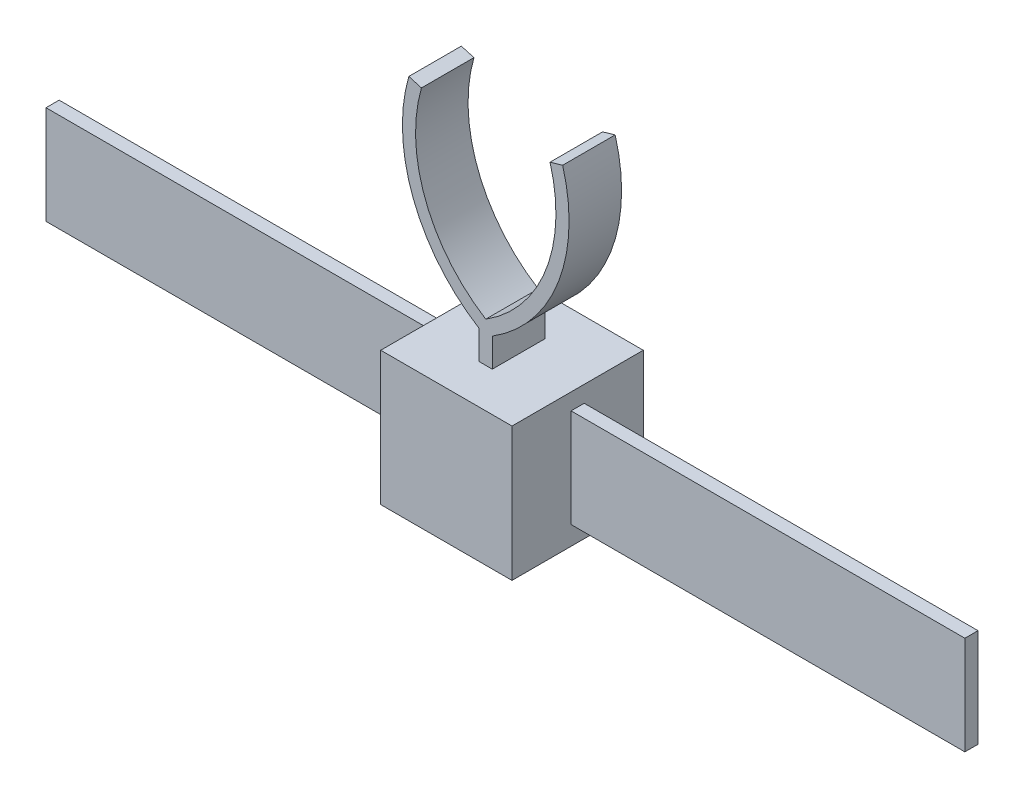
ISO-10303-21;
HEADER;
FILE_DESCRIPTION(('STEP AP214'),'2;1');
FILE_NAME('part.step','',(''),(''),'','','');
FILE_SCHEMA(('AUTOMOTIVE_DESIGN { 1 0 10303 214 1 1 1 1 }'));
ENDSEC;
DATA;
#1=APPLICATION_CONTEXT('core data for automotive mechanical design processes');
#2=APPLICATION_PROTOCOL_DEFINITION('international standard','automotive_design',2000,#1);
#3=PRODUCT_CONTEXT('',#1,'mechanical');
#4=PRODUCT('Part','Part','',(#3));
#5=PRODUCT_RELATED_PRODUCT_CATEGORY('part','',(#4));
#6=PRODUCT_DEFINITION_FORMATION('','',#4);
#7=PRODUCT_DEFINITION_CONTEXT('part definition',#1,'design');
#8=PRODUCT_DEFINITION('design','',#6,#7);
#9=PRODUCT_DEFINITION_SHAPE('','',#8);
#10=(LENGTH_UNIT() NAMED_UNIT(*) SI_UNIT(.MILLI.,.METRE.));
#11=(NAMED_UNIT(*) PLANE_ANGLE_UNIT() SI_UNIT($,.RADIAN.));
#12=(NAMED_UNIT(*) SI_UNIT($,.STERADIAN.) SOLID_ANGLE_UNIT());
#13=UNCERTAINTY_MEASURE_WITH_UNIT(LENGTH_MEASURE(1.E-05),#10,'distance_accuracy_value','');
#14=(GEOMETRIC_REPRESENTATION_CONTEXT(3) GLOBAL_UNCERTAINTY_ASSIGNED_CONTEXT((#13)) GLOBAL_UNIT_ASSIGNED_CONTEXT((#10,
#11,#12)) REPRESENTATION_CONTEXT('',''));
#15=CARTESIAN_POINT('',(0.,0.,0.));
#16=DIRECTION('',(0.,0.,1.));
#17=DIRECTION('',(1.,0.,0.));
#18=AXIS2_PLACEMENT_3D('',#15,#16,#17);
#19=CARTESIAN_POINT('',(50.,-50.9333333333334,100.));
#20=DIRECTION('',(-1.,0.,0.));
#21=DIRECTION('',(0.,0.,1.));
#22=AXIS2_PLACEMENT_3D('',#19,#20,#21);
#23=PLANE('',#22);
#24=DIRECTION('',(0.,0.,1.));
#25=VECTOR('',#24,1.);
#26=CARTESIAN_POINT('',(50.,-36.5666666666666,100.));
#27=LINE('',#26,#25);
#28=CARTESIAN_POINT('',(50.,-36.5666666666666,45.));
#29=VERTEX_POINT('',#28);
#30=CARTESIAN_POINT('',(50.,-36.5666666666666,55.));
#31=VERTEX_POINT('',#30);
#32=EDGE_CURVE('E408',#29,#31,#27,.T.);
#33=ORIENTED_EDGE('',*,*,#32,.T.);
#34=DIRECTION('',(0.,1.,0.));
#35=VECTOR('',#34,1.);
#36=CARTESIAN_POINT('',(50.,-50.9333333333334,55.));
#37=LINE('',#36,#35);
#38=CARTESIAN_POINT('',(50.,38.4333333333334,55.));
#39=VERTEX_POINT('',#38);
#40=EDGE_CURVE('E428',#31,#39,#37,.T.);
#41=ORIENTED_EDGE('',*,*,#40,.T.);
#42=DIRECTION('',(0.,0.,-1.));
#43=VECTOR('',#42,1.);
#44=CARTESIAN_POINT('',(50.,38.4333333333334,100.));
#45=LINE('',#44,#43);
#46=CARTESIAN_POINT('',(50.,38.4333333333334,45.));
#47=VERTEX_POINT('',#46);
#48=EDGE_CURVE('E425',#39,#47,#45,.T.);
#49=ORIENTED_EDGE('',*,*,#48,.T.);
#50=DIRECTION('',(0.,-1.,0.));
#51=VECTOR('',#50,1.);
#52=CARTESIAN_POINT('',(50.,-50.9333333333334,45.));
#53=LINE('',#52,#51);
#54=EDGE_CURVE('E422',#47,#29,#53,.T.);
#55=ORIENTED_EDGE('',*,*,#54,.T.);
#56=EDGE_LOOP('',(#33,#41,#49,#55));
#57=FACE_BOUND('',#56,.T.);
#58=DIRECTION('',(0.,1.,0.));
#59=VECTOR('',#58,1.);
#60=CARTESIAN_POINT('',(50.,-50.9333333333334,0.));
#61=LINE('',#60,#59);
#62=CARTESIAN_POINT('',(50.,-50.9333333333334,0.));
#63=VERTEX_POINT('',#62);
#64=CARTESIAN_POINT('',(50.,50.9333333333334,0.));
#65=VERTEX_POINT('',#64);
#66=EDGE_CURVE('E431',#63,#65,#61,.T.);
#67=ORIENTED_EDGE('',*,*,#66,.T.);
#68=DIRECTION('',(0.,0.,-1.));
#69=VECTOR('',#68,1.);
#70=CARTESIAN_POINT('',(50.,50.9333333333334,100.));
#71=LINE('',#70,#69);
#72=CARTESIAN_POINT('',(50.,50.9333333333334,100.));
#73=VERTEX_POINT('',#72);
#74=EDGE_CURVE('E458',#73,#65,#71,.T.);
#75=ORIENTED_EDGE('',*,*,#74,.F.);
#76=DIRECTION('',(0.,1.,0.));
#77=VECTOR('',#76,1.);
#78=CARTESIAN_POINT('',(50.,-50.9333333333334,100.));
#79=LINE('',#78,#77);
#80=CARTESIAN_POINT('',(50.,-50.9333333333334,100.));
#81=VERTEX_POINT('',#80);
#82=EDGE_CURVE('E432',#81,#73,#79,.T.);
#83=ORIENTED_EDGE('',*,*,#82,.F.);
#84=DIRECTION('',(0.,0.,-1.));
#85=VECTOR('',#84,1.);
#86=CARTESIAN_POINT('',(50.,-50.9333333333334,100.));
#87=LINE('',#86,#85);
#88=EDGE_CURVE('E442',#81,#63,#87,.T.);
#89=ORIENTED_EDGE('',*,*,#88,.T.);
#90=EDGE_LOOP('',(#67,#75,#83,#89));
#91=FACE_BOUND('',#90,.T.);
#92=ADVANCED_FACE('F176',(#57,#91),#23,.F.);
#93=CARTESIAN_POINT('',(-50.,50.9333333333334,100.));
#94=DIRECTION('',(0.,-1.,0.));
#95=DIRECTION('',(0.,0.,-1.));
#96=AXIS2_PLACEMENT_3D('',#93,#94,#95);
#97=PLANE('',#96);
#98=DIRECTION('',(0.,0.,-1.));
#99=VECTOR('',#98,1.);
#100=CARTESIAN_POINT('',(5.,50.9333333333334,100.));
#101=LINE('',#100,#99);
#102=CARTESIAN_POINT('',(5.,50.9333333333334,70.));
#103=VERTEX_POINT('',#102);
#104=CARTESIAN_POINT('',(5.,50.9333333333334,30.));
#105=VERTEX_POINT('',#104);
#106=EDGE_CURVE('E183',#103,#105,#101,.T.);
#107=ORIENTED_EDGE('',*,*,#106,.F.);
#108=DIRECTION('',(-1.,0.,0.));
#109=VECTOR('',#108,1.);
#110=CARTESIAN_POINT('',(-50.,50.9333333333334,70.));
#111=LINE('',#110,#109);
#112=CARTESIAN_POINT('',(-5.,50.9333333333334,70.));
#113=VERTEX_POINT('',#112);
#114=EDGE_CURVE('E12',#103,#113,#111,.T.);
#115=ORIENTED_EDGE('',*,*,#114,.T.);
#116=DIRECTION('',(0.,0.,-1.));
#117=VECTOR('',#116,1.);
#118=CARTESIAN_POINT('',(-5.,50.9333333333334,100.));
#119=LINE('',#118,#117);
#120=CARTESIAN_POINT('',(-5.,50.9333333333334,30.));
#121=VERTEX_POINT('',#120);
#122=EDGE_CURVE('E476',#113,#121,#119,.T.);
#123=ORIENTED_EDGE('',*,*,#122,.T.);
#124=DIRECTION('',(-1.,0.,0.));
#125=VECTOR('',#124,1.);
#126=CARTESIAN_POINT('',(-50.,50.9333333333334,30.));
#127=LINE('',#126,#125);
#128=EDGE_CURVE('E473',#105,#121,#127,.T.);
#129=ORIENTED_EDGE('',*,*,#128,.F.);
#130=EDGE_LOOP('',(#107,#115,#123,#129));
#131=FACE_BOUND('',#130,.T.);
#132=DIRECTION('',(-1.,0.,0.));
#133=VECTOR('',#132,1.);
#134=CARTESIAN_POINT('',(-50.,50.9333333333334,0.));
#135=LINE('',#134,#133);
#136=CARTESIAN_POINT('',(-50.,50.9333333333334,0.));
#137=VERTEX_POINT('',#136);
#138=EDGE_CURVE('E445',#65,#137,#135,.T.);
#139=ORIENTED_EDGE('',*,*,#138,.T.);
#140=DIRECTION('',(0.,0.,-1.));
#141=VECTOR('',#140,1.);
#142=CARTESIAN_POINT('',(-50.,50.9333333333334,100.));
#143=LINE('',#142,#141);
#144=CARTESIAN_POINT('',(-50.,50.9333333333334,100.));
#145=VERTEX_POINT('',#144);
#146=EDGE_CURVE('E455',#145,#137,#143,.T.);
#147=ORIENTED_EDGE('',*,*,#146,.F.);
#148=DIRECTION('',(-1.,0.,0.));
#149=VECTOR('',#148,1.);
#150=CARTESIAN_POINT('',(-50.,50.9333333333334,100.));
#151=LINE('',#150,#149);
#152=EDGE_CURVE('E435',#73,#145,#151,.T.);
#153=ORIENTED_EDGE('',*,*,#152,.F.);
#154=ORIENTED_EDGE('',*,*,#74,.T.);
#155=EDGE_LOOP('',(#139,#147,#153,#154));
#156=FACE_BOUND('',#155,.T.);
#157=ADVANCED_FACE('F517',(#131,#156),#97,.F.);
#158=CARTESIAN_POINT('',(-50.,-50.9333333333334,100.));
#159=DIRECTION('',(1.,0.,0.));
#160=DIRECTION('',(0.,0.,-1.));
#161=AXIS2_PLACEMENT_3D('',#158,#159,#160);
#162=PLANE('',#161);
#163=DIRECTION('',(0.,0.,1.));
#164=VECTOR('',#163,1.);
#165=CARTESIAN_POINT('',(-50.,38.4333333333334,100.));
#166=LINE('',#165,#164);
#167=CARTESIAN_POINT('',(-50.,38.4333333333334,45.));
#168=VERTEX_POINT('',#167);
#169=CARTESIAN_POINT('',(-50.,38.4333333333334,55.));
#170=VERTEX_POINT('',#169);
#171=EDGE_CURVE('E467',#168,#170,#166,.T.);
#172=ORIENTED_EDGE('',*,*,#171,.T.);
#173=DIRECTION('',(0.,-1.,0.));
#174=VECTOR('',#173,1.);
#175=CARTESIAN_POINT('',(-50.,-50.9333333333334,55.));
#176=LINE('',#175,#174);
#177=CARTESIAN_POINT('',(-50.,-36.5666666666666,55.));
#178=VERTEX_POINT('',#177);
#179=EDGE_CURVE('E470',#170,#178,#176,.T.);
#180=ORIENTED_EDGE('',*,*,#179,.T.);
#181=DIRECTION('',(0.,0.,-1.));
#182=VECTOR('',#181,1.);
#183=CARTESIAN_POINT('',(-50.,-36.5666666666666,100.));
#184=LINE('',#183,#182);
#185=CARTESIAN_POINT('',(-50.,-36.5666666666666,45.));
#186=VERTEX_POINT('',#185);
#187=EDGE_CURVE('E461',#178,#186,#184,.T.);
#188=ORIENTED_EDGE('',*,*,#187,.T.);
#189=DIRECTION('',(0.,1.,0.));
#190=VECTOR('',#189,1.);
#191=CARTESIAN_POINT('',(-50.,-50.9333333333334,45.));
#192=LINE('',#191,#190);
#193=EDGE_CURVE('E464',#186,#168,#192,.T.);
#194=ORIENTED_EDGE('',*,*,#193,.T.);
#195=EDGE_LOOP('',(#172,#180,#188,#194));
#196=FACE_BOUND('',#195,.T.);
#197=DIRECTION('',(0.,-1.,0.));
#198=VECTOR('',#197,1.);
#199=CARTESIAN_POINT('',(-50.,-50.9333333333334,0.));
#200=LINE('',#199,#198);
#201=CARTESIAN_POINT('',(-50.,-50.9333333333334,0.));
#202=VERTEX_POINT('',#201);
#203=EDGE_CURVE('E447',#137,#202,#200,.T.);
#204=ORIENTED_EDGE('',*,*,#203,.T.);
#205=DIRECTION('',(0.,0.,-1.));
#206=VECTOR('',#205,1.);
#207=CARTESIAN_POINT('',(-50.,-50.9333333333334,100.));
#208=LINE('',#207,#206);
#209=CARTESIAN_POINT('',(-50.,-50.9333333333334,100.));
#210=VERTEX_POINT('',#209);
#211=EDGE_CURVE('E452',#210,#202,#208,.T.);
#212=ORIENTED_EDGE('',*,*,#211,.F.);
#213=DIRECTION('',(0.,-1.,0.));
#214=VECTOR('',#213,1.);
#215=CARTESIAN_POINT('',(-50.,-50.9333333333334,100.));
#216=LINE('',#215,#214);
#217=EDGE_CURVE('E438',#145,#210,#216,.T.);
#218=ORIENTED_EDGE('',*,*,#217,.F.);
#219=ORIENTED_EDGE('',*,*,#146,.T.);
#220=EDGE_LOOP('',(#204,#212,#218,#219));
#221=FACE_BOUND('',#220,.T.);
#222=ADVANCED_FACE('F523',(#196,#221),#162,.F.);
#223=CARTESIAN_POINT('',(-50.,-50.9333333333334,100.));
#224=DIRECTION('',(0.,1.,0.));
#225=DIRECTION('',(0.,0.,1.));
#226=AXIS2_PLACEMENT_3D('',#223,#224,#225);
#227=PLANE('',#226);
#228=DIRECTION('',(1.,0.,0.));
#229=VECTOR('',#228,1.);
#230=CARTESIAN_POINT('',(-50.,-50.9333333333334,0.));
#231=LINE('',#230,#229);
#232=EDGE_CURVE('E436',#202,#63,#231,.T.);
#233=ORIENTED_EDGE('',*,*,#232,.T.);
#234=ORIENTED_EDGE('',*,*,#88,.F.);
#235=DIRECTION('',(1.,0.,0.));
#236=VECTOR('',#235,1.);
#237=CARTESIAN_POINT('',(-50.,-50.9333333333334,100.));
#238=LINE('',#237,#236);
#239=EDGE_CURVE('E440',#210,#81,#238,.T.);
#240=ORIENTED_EDGE('',*,*,#239,.F.);
#241=ORIENTED_EDGE('',*,*,#211,.T.);
#242=EDGE_LOOP('',(#233,#234,#240,#241));
#243=FACE_BOUND('',#242,.T.);
#244=ADVANCED_FACE('F541',(#243),#227,.F.);
#245=CARTESIAN_POINT('',(0.,0.,100.));
#246=DIRECTION('',(0.,0.,-1.));
#247=DIRECTION('',(-1.,0.,0.));
#248=AXIS2_PLACEMENT_3D('',#245,#246,#247);
#249=PLANE('',#248);
#250=ORIENTED_EDGE('',*,*,#82,.T.);
#251=ORIENTED_EDGE('',*,*,#152,.T.);
#252=ORIENTED_EDGE('',*,*,#217,.T.);
#253=ORIENTED_EDGE('',*,*,#239,.T.);
#254=EDGE_LOOP('',(#250,#251,#252,#253));
#255=FACE_BOUND('',#254,.T.);
#256=ADVANCED_FACE('F537',(#255),#249,.F.);
#257=CARTESIAN_POINT('',(0.,0.,0.));
#258=DIRECTION('',(0.,0.,-1.));
#259=DIRECTION('',(-1.,0.,0.));
#260=AXIS2_PLACEMENT_3D('',#257,#258,#259);
#261=PLANE('',#260);
#262=ORIENTED_EDGE('',*,*,#66,.F.);
#263=ORIENTED_EDGE('',*,*,#232,.F.);
#264=ORIENTED_EDGE('',*,*,#203,.F.);
#265=ORIENTED_EDGE('',*,*,#138,.F.);
#266=EDGE_LOOP('',(#262,#263,#264,#265));
#267=FACE_BOUND('',#266,.T.);
#268=ADVANCED_FACE('F531',(#267),#261,.T.);
#269=CARTESIAN_POINT('',(-350.,0.,0.));
#270=DIRECTION('',(-1.,0.,0.));
#271=DIRECTION('',(0.,0.,1.));
#272=AXIS2_PLACEMENT_3D('',#269,#270,#271);
#273=PLANE('',#272);
#274=DIRECTION('',(0.,-1.,0.));
#275=VECTOR('',#274,1.);
#276=CARTESIAN_POINT('',(-350.,-36.5666666666666,55.));
#277=LINE('',#276,#275);
#278=CARTESIAN_POINT('',(-350.,38.4333333333334,55.));
#279=VERTEX_POINT('',#278);
#280=CARTESIAN_POINT('',(-350.,-36.5666666666666,55.));
#281=VERTEX_POINT('',#280);
#282=EDGE_CURVE('E392',#279,#281,#277,.T.);
#283=ORIENTED_EDGE('',*,*,#282,.F.);
#284=DIRECTION('',(0.,0.,1.));
#285=VECTOR('',#284,1.);
#286=CARTESIAN_POINT('',(-350.,38.4333333333334,55.));
#287=LINE('',#286,#285);
#288=CARTESIAN_POINT('',(-350.,38.4333333333334,45.));
#289=VERTEX_POINT('',#288);
#290=EDGE_CURVE('E401',#289,#279,#287,.T.);
#291=ORIENTED_EDGE('',*,*,#290,.F.);
#292=DIRECTION('',(0.,1.,0.));
#293=VECTOR('',#292,1.);
#294=CARTESIAN_POINT('',(-350.,-36.5666666666666,45.));
#295=LINE('',#294,#293);
#296=CARTESIAN_POINT('',(-350.,-36.5666666666666,45.));
#297=VERTEX_POINT('',#296);
#298=EDGE_CURVE('E398',#297,#289,#295,.T.);
#299=ORIENTED_EDGE('',*,*,#298,.F.);
#300=DIRECTION('',(0.,0.,-1.));
#301=VECTOR('',#300,1.);
#302=CARTESIAN_POINT('',(-350.,-36.5666666666666,55.));
#303=LINE('',#302,#301);
#304=EDGE_CURVE('E395',#281,#297,#303,.T.);
#305=ORIENTED_EDGE('',*,*,#304,.F.);
#306=EDGE_LOOP('',(#283,#291,#299,#305));
#307=FACE_BOUND('',#306,.T.);
#308=ADVANCED_FACE('F553',(#307),#273,.T.);
#309=CARTESIAN_POINT('',(-350.,-36.5666666666666,55.));
#310=DIRECTION('',(0.,-1.,0.));
#311=DIRECTION('',(0.,0.,-1.));
#312=AXIS2_PLACEMENT_3D('',#309,#310,#311);
#313=PLANE('',#312);
#314=ORIENTED_EDGE('',*,*,#187,.F.);
#315=DIRECTION('',(1.,0.,0.));
#316=VECTOR('',#315,1.);
#317=CARTESIAN_POINT('',(-350.,-36.5666666666666,55.));
#318=LINE('',#317,#316);
#319=EDGE_CURVE('E417',#281,#178,#318,.T.);
#320=ORIENTED_EDGE('',*,*,#319,.F.);
#321=ORIENTED_EDGE('',*,*,#304,.T.);
#322=DIRECTION('',(1.,0.,0.));
#323=VECTOR('',#322,1.);
#324=CARTESIAN_POINT('',(-350.,-36.5666666666666,45.));
#325=LINE('',#324,#323);
#326=EDGE_CURVE('E414',#297,#186,#325,.T.);
#327=ORIENTED_EDGE('',*,*,#326,.T.);
#328=EDGE_LOOP('',(#314,#320,#321,#327));
#329=FACE_BOUND('',#328,.T.);
#330=ADVANCED_FACE('F568',(#329),#313,.T.);
#331=CARTESIAN_POINT('',(-350.,-36.5666666666666,45.));
#332=DIRECTION('',(0.,0.,-1.));
#333=DIRECTION('',(-1.,0.,0.));
#334=AXIS2_PLACEMENT_3D('',#331,#332,#333);
#335=PLANE('',#334);
#336=ORIENTED_EDGE('',*,*,#193,.F.);
#337=ORIENTED_EDGE('',*,*,#326,.F.);
#338=ORIENTED_EDGE('',*,*,#298,.T.);
#339=DIRECTION('',(1.,0.,0.));
#340=VECTOR('',#339,1.);
#341=CARTESIAN_POINT('',(-350.,38.4333333333334,45.));
#342=LINE('',#341,#340);
#343=EDGE_CURVE('E410',#289,#168,#342,.T.);
#344=ORIENTED_EDGE('',*,*,#343,.T.);
#345=EDGE_LOOP('',(#336,#337,#338,#344));
#346=FACE_BOUND('',#345,.T.);
#347=ADVANCED_FACE('F572',(#346),#335,.T.);
#348=CARTESIAN_POINT('',(-350.,38.4333333333334,55.));
#349=DIRECTION('',(0.,1.,0.));
#350=DIRECTION('',(0.,0.,1.));
#351=AXIS2_PLACEMENT_3D('',#348,#349,#350);
#352=PLANE('',#351);
#353=ORIENTED_EDGE('',*,*,#171,.F.);
#354=ORIENTED_EDGE('',*,*,#343,.F.);
#355=ORIENTED_EDGE('',*,*,#290,.T.);
#356=DIRECTION('',(1.,0.,0.));
#357=VECTOR('',#356,1.);
#358=CARTESIAN_POINT('',(-350.,38.4333333333334,55.));
#359=LINE('',#358,#357);
#360=EDGE_CURVE('E405',#279,#170,#359,.T.);
#361=ORIENTED_EDGE('',*,*,#360,.T.);
#362=EDGE_LOOP('',(#353,#354,#355,#361));
#363=FACE_BOUND('',#362,.T.);
#364=ADVANCED_FACE('F576',(#363),#352,.T.);
#365=CARTESIAN_POINT('',(-350.,-36.5666666666666,55.));
#366=DIRECTION('',(0.,0.,1.));
#367=DIRECTION('',(1.,0.,0.));
#368=AXIS2_PLACEMENT_3D('',#365,#366,#367);
#369=PLANE('',#368);
#370=ORIENTED_EDGE('',*,*,#179,.F.);
#371=ORIENTED_EDGE('',*,*,#360,.F.);
#372=ORIENTED_EDGE('',*,*,#282,.T.);
#373=ORIENTED_EDGE('',*,*,#319,.T.);
#374=EDGE_LOOP('',(#370,#371,#372,#373));
#375=FACE_BOUND('',#374,.T.);
#376=ADVANCED_FACE('F560',(#375),#369,.T.);
#377=ORIENTED_EDGE('',*,*,#40,.F.);
#378=CARTESIAN_POINT('',(350.,-36.5666666666666,55.));
#379=VERTEX_POINT('',#378);
#380=EDGE_CURVE('E404',#31,#379,#318,.T.);
#381=ORIENTED_EDGE('',*,*,#380,.T.);
#382=DIRECTION('',(0.,-1.,0.));
#383=VECTOR('',#382,1.);
#384=CARTESIAN_POINT('',(350.,-36.5666666666666,55.));
#385=LINE('',#384,#383);
#386=CARTESIAN_POINT('',(350.,38.4333333333334,55.));
#387=VERTEX_POINT('',#386);
#388=EDGE_CURVE('E379',#387,#379,#385,.T.);
#389=ORIENTED_EDGE('',*,*,#388,.F.);
#390=EDGE_CURVE('E409',#39,#387,#359,.T.);
#391=ORIENTED_EDGE('',*,*,#390,.F.);
#392=EDGE_LOOP('',(#377,#381,#389,#391));
#393=FACE_BOUND('',#392,.T.);
#394=ADVANCED_FACE('F556',(#393),#369,.T.);
#395=ORIENTED_EDGE('',*,*,#48,.F.);
#396=ORIENTED_EDGE('',*,*,#390,.T.);
#397=DIRECTION('',(0.,0.,1.));
#398=VECTOR('',#397,1.);
#399=CARTESIAN_POINT('',(350.,38.4333333333334,55.));
#400=LINE('',#399,#398);
#401=CARTESIAN_POINT('',(350.,38.4333333333334,45.));
#402=VERTEX_POINT('',#401);
#403=EDGE_CURVE('E389',#402,#387,#400,.T.);
#404=ORIENTED_EDGE('',*,*,#403,.F.);
#405=EDGE_CURVE('E413',#47,#402,#342,.T.);
#406=ORIENTED_EDGE('',*,*,#405,.F.);
#407=EDGE_LOOP('',(#395,#396,#404,#406));
#408=FACE_BOUND('',#407,.T.);
#409=ADVANCED_FACE('F559',(#408),#352,.T.);
#410=ORIENTED_EDGE('',*,*,#54,.F.);
#411=ORIENTED_EDGE('',*,*,#405,.T.);
#412=DIRECTION('',(0.,1.,0.));
#413=VECTOR('',#412,1.);
#414=CARTESIAN_POINT('',(350.,-36.5666666666666,45.));
#415=LINE('',#414,#413);
#416=CARTESIAN_POINT('',(350.,-36.5666666666666,45.));
#417=VERTEX_POINT('',#416);
#418=EDGE_CURVE('E386',#417,#402,#415,.T.);
#419=ORIENTED_EDGE('',*,*,#418,.F.);
#420=EDGE_CURVE('E416',#29,#417,#325,.T.);
#421=ORIENTED_EDGE('',*,*,#420,.F.);
#422=EDGE_LOOP('',(#410,#411,#419,#421));
#423=FACE_BOUND('',#422,.T.);
#424=ADVANCED_FACE('F566',(#423),#335,.T.);
#425=ORIENTED_EDGE('',*,*,#32,.F.);
#426=ORIENTED_EDGE('',*,*,#420,.T.);
#427=DIRECTION('',(0.,0.,-1.));
#428=VECTOR('',#427,1.);
#429=CARTESIAN_POINT('',(350.,-36.5666666666666,55.));
#430=LINE('',#429,#428);
#431=EDGE_CURVE('E383',#379,#417,#430,.T.);
#432=ORIENTED_EDGE('',*,*,#431,.F.);
#433=ORIENTED_EDGE('',*,*,#380,.F.);
#434=EDGE_LOOP('',(#425,#426,#432,#433));
#435=FACE_BOUND('',#434,.T.);
#436=ADVANCED_FACE('F562',(#435),#313,.T.);
#437=CARTESIAN_POINT('',(350.,0.,0.));
#438=DIRECTION('',(-1.,0.,0.));
#439=DIRECTION('',(0.,0.,1.));
#440=AXIS2_PLACEMENT_3D('',#437,#438,#439);
#441=PLANE('',#440);
#442=ORIENTED_EDGE('',*,*,#388,.T.);
#443=ORIENTED_EDGE('',*,*,#431,.T.);
#444=ORIENTED_EDGE('',*,*,#418,.T.);
#445=ORIENTED_EDGE('',*,*,#403,.T.);
#446=EDGE_LOOP('',(#442,#443,#444,#445));
#447=FACE_BOUND('',#446,.T.);
#448=ADVANCED_FACE('F565',(#447),#441,.F.);
#449=CARTESIAN_POINT('',(-60.1432001285634,177.841853262016,70.));
#450=DIRECTION('',(0.,0.,1.));
#451=DIRECTION('',(1.,0.,0.));
#452=AXIS2_PLACEMENT_3D('',#449,#450,#451);
#453=PLANE('',#452);
#454=ORIENTED_EDGE('',*,*,#114,.F.);
#455=DIRECTION('',(0.,1.,0.));
#456=VECTOR('',#455,1.);
#457=CARTESIAN_POINT('',(5.,39.6943721386407,70.));
#458=LINE('',#457,#456);
#459=CARTESIAN_POINT('',(5.,72.7673615493796,70.));
#460=VERTEX_POINT('',#459);
#461=EDGE_CURVE('E341',#103,#460,#458,.T.);
#462=ORIENTED_EDGE('',*,*,#461,.T.);
#463=CARTESIAN_POINT('',(-60.1432001285634,177.841853262016,70.));
#464=DIRECTION('',(0.,0.,1.));
#465=DIRECTION('',(1.,0.,0.));
#466=AXIS2_PLACEMENT_3D('',#463,#464,#465);
#467=CIRCLE('',#466,123.62962966724);
#468=CARTESIAN_POINT('',(58.5912673437857,212.28617885734,70.));
#469=VERTEX_POINT('',#468);
#470=EDGE_CURVE('E332',#460,#469,#467,.T.);
#471=ORIENTED_EDGE('',*,*,#470,.T.);
#472=DIRECTION('',(0.960404619765771,0.278608984658723,0.));
#473=VECTOR('',#472,1.);
#474=CARTESIAN_POINT('',(48.9872211461279,209.500089010753,70.));
#475=LINE('',#474,#473);
#476=CARTESIAN_POINT('',(48.9872211461279,209.500089010753,70.));
#477=VERTEX_POINT('',#476);
#478=EDGE_CURVE('E359',#477,#469,#475,.T.);
#479=ORIENTED_EDGE('',*,*,#478,.F.);
#480=CARTESIAN_POINT('',(-60.1432001285634,177.841853262016,70.));
#481=DIRECTION('',(0.,0.,1.));
#482=DIRECTION('',(1.,0.,0.));
#483=AXIS2_PLACEMENT_3D('',#480,#481,#482);
#484=CIRCLE('',#483,113.62962966724);
#485=CARTESIAN_POINT('',(0.,81.4339271531647,70.));
#486=VERTEX_POINT('',#485);
#487=EDGE_CURVE('E362',#486,#477,#484,.T.);
#488=ORIENTED_EDGE('',*,*,#487,.F.);
#489=CARTESIAN_POINT('',(60.1432001285634,177.841853262016,70.));
#490=DIRECTION('',(0.,0.,1.));
#491=DIRECTION('',(1.,0.,0.));
#492=AXIS2_PLACEMENT_3D('',#489,#490,#491);
#493=CIRCLE('',#492,113.62962966724);
#494=CARTESIAN_POINT('',(-48.9872211461279,209.500089010753,70.));
#495=VERTEX_POINT('',#494);
#496=EDGE_CURVE('E351',#486,#495,#493,.F.);
#497=ORIENTED_EDGE('',*,*,#496,.T.);
#498=DIRECTION('',(0.960404619765771,-0.278608984658723,0.));
#499=VECTOR('',#498,1.);
#500=CARTESIAN_POINT('',(-58.5912673437857,212.28617885734,70.));
#501=LINE('',#500,#499);
#502=CARTESIAN_POINT('',(-58.5912673437857,212.28617885734,70.));
#503=VERTEX_POINT('',#502);
#504=EDGE_CURVE('E331',#503,#495,#501,.T.);
#505=ORIENTED_EDGE('',*,*,#504,.F.);
#506=CARTESIAN_POINT('',(60.1432001285634,177.841853262016,70.));
#507=DIRECTION('',(0.,0.,1.));
#508=DIRECTION('',(1.,0.,0.));
#509=AXIS2_PLACEMENT_3D('',#506,#507,#508);
#510=CIRCLE('',#509,123.62962966724);
#511=CARTESIAN_POINT('',(-5.,72.7673615493796,70.));
#512=VERTEX_POINT('',#511);
#513=EDGE_CURVE('E354',#512,#503,#510,.F.);
#514=ORIENTED_EDGE('',*,*,#513,.F.);
#515=DIRECTION('',(0.,1.,0.));
#516=VECTOR('',#515,1.);
#517=CARTESIAN_POINT('',(-5.,39.6943721386407,70.));
#518=LINE('',#517,#516);
#519=EDGE_CURVE('E346',#113,#512,#518,.T.);
#520=ORIENTED_EDGE('',*,*,#519,.F.);
#521=EDGE_LOOP('',(#454,#462,#471,#479,#488,#497,#505,#514,#520));
#522=FACE_BOUND('',#521,.T.);
#523=ADVANCED_FACE('F493',(#522),#453,.T.);
#524=CARTESIAN_POINT('',(5.,39.6943721386407,70.));
#525=DIRECTION('',(-1.,0.,0.));
#526=DIRECTION('',(0.,0.,1.));
#527=AXIS2_PLACEMENT_3D('',#524,#525,#526);
#528=PLANE('',#527);
#529=ORIENTED_EDGE('',*,*,#461,.F.);
#530=ORIENTED_EDGE('',*,*,#106,.T.);
#531=DIRECTION('',(0.,1.,0.));
#532=VECTOR('',#531,1.);
#533=CARTESIAN_POINT('',(5.,39.6943721386407,30.));
#534=LINE('',#533,#532);
#535=CARTESIAN_POINT('',(5.,72.7673615493796,30.));
#536=VERTEX_POINT('',#535);
#537=EDGE_CURVE('E481',#105,#536,#534,.T.);
#538=ORIENTED_EDGE('',*,*,#537,.T.);
#539=DIRECTION('',(0.,0.,1.));
#540=VECTOR('',#539,1.);
#541=CARTESIAN_POINT('',(5.,72.7673615493796,30.));
#542=LINE('',#541,#540);
#543=EDGE_CURVE('E366',#460,#536,#542,.F.);
#544=ORIENTED_EDGE('',*,*,#543,.F.);
#545=EDGE_LOOP('',(#529,#530,#538,#544));
#546=FACE_BOUND('',#545,.T.);
#547=ADVANCED_FACE('F479',(#546),#528,.F.);
#548=CARTESIAN_POINT('',(-5.,39.6943721386407,70.));
#549=DIRECTION('',(-1.,0.,0.));
#550=DIRECTION('',(0.,0.,1.));
#551=AXIS2_PLACEMENT_3D('',#548,#549,#550);
#552=PLANE('',#551);
#553=ORIENTED_EDGE('',*,*,#122,.F.);
#554=ORIENTED_EDGE('',*,*,#519,.T.);
#555=DIRECTION('',(0.,0.,-1.));
#556=VECTOR('',#555,1.);
#557=CARTESIAN_POINT('',(-5.,72.7673615493796,70.));
#558=LINE('',#557,#556);
#559=CARTESIAN_POINT('',(-5.,72.7673615493796,30.));
#560=VERTEX_POINT('',#559);
#561=EDGE_CURVE('E348',#512,#560,#558,.T.);
#562=ORIENTED_EDGE('',*,*,#561,.T.);
#563=DIRECTION('',(0.,1.,0.));
#564=VECTOR('',#563,1.);
#565=CARTESIAN_POINT('',(-5.,39.6943721386407,30.));
#566=LINE('',#565,#564);
#567=EDGE_CURVE('E324',#121,#560,#566,.T.);
#568=ORIENTED_EDGE('',*,*,#567,.F.);
#569=EDGE_LOOP('',(#553,#554,#562,#568));
#570=FACE_BOUND('',#569,.T.);
#571=ADVANCED_FACE('F487',(#570),#552,.T.);
#572=CARTESIAN_POINT('',(-60.1432001285634,177.841853262016,30.));
#573=DIRECTION('',(0.,0.,1.));
#574=DIRECTION('',(1.,0.,0.));
#575=AXIS2_PLACEMENT_3D('',#572,#573,#574);
#576=PLANE('',#575);
#577=ORIENTED_EDGE('',*,*,#537,.F.);
#578=ORIENTED_EDGE('',*,*,#128,.T.);
#579=ORIENTED_EDGE('',*,*,#567,.T.);
#580=CARTESIAN_POINT('',(60.1432001285634,177.841853262016,30.));
#581=DIRECTION('',(0.,0.,1.));
#582=DIRECTION('',(1.,0.,0.));
#583=AXIS2_PLACEMENT_3D('',#580,#581,#582);
#584=CIRCLE('',#583,123.62962966724);
#585=CARTESIAN_POINT('',(-58.5912673437857,212.28617885734,30.));
#586=VERTEX_POINT('',#585);
#587=EDGE_CURVE('E339',#560,#586,#584,.F.);
#588=ORIENTED_EDGE('',*,*,#587,.T.);
#589=DIRECTION('',(0.960404619765771,-0.278608984658723,0.));
#590=VECTOR('',#589,1.);
#591=CARTESIAN_POINT('',(-58.5912673437857,212.28617885734,30.));
#592=LINE('',#591,#590);
#593=CARTESIAN_POINT('',(-48.9872211461279,209.500089010753,30.));
#594=VERTEX_POINT('',#593);
#595=EDGE_CURVE('E323',#586,#594,#592,.T.);
#596=ORIENTED_EDGE('',*,*,#595,.T.);
#597=CARTESIAN_POINT('',(60.1432001285634,177.841853262016,30.));
#598=DIRECTION('',(0.,0.,1.));
#599=DIRECTION('',(1.,0.,0.));
#600=AXIS2_PLACEMENT_3D('',#597,#598,#599);
#601=CIRCLE('',#600,113.62962966724);
#602=CARTESIAN_POINT('',(0.,81.4339271531647,30.));
#603=VERTEX_POINT('',#602);
#604=EDGE_CURVE('E313',#603,#594,#601,.F.);
#605=ORIENTED_EDGE('',*,*,#604,.F.);
#606=CARTESIAN_POINT('',(-60.1432001285634,177.841853262016,30.));
#607=DIRECTION('',(0.,0.,1.));
#608=DIRECTION('',(1.,0.,0.));
#609=AXIS2_PLACEMENT_3D('',#606,#607,#608);
#610=CIRCLE('',#609,113.62962966724);
#611=CARTESIAN_POINT('',(48.9872211461279,209.500089010753,30.));
#612=VERTEX_POINT('',#611);
#613=EDGE_CURVE('E374',#603,#612,#610,.T.);
#614=ORIENTED_EDGE('',*,*,#613,.T.);
#615=DIRECTION('',(0.960404619765771,0.278608984658723,0.));
#616=VECTOR('',#615,1.);
#617=CARTESIAN_POINT('',(48.9872211461279,209.500089010753,30.));
#618=LINE('',#617,#616);
#619=CARTESIAN_POINT('',(58.5912673437857,212.28617885734,30.));
#620=VERTEX_POINT('',#619);
#621=EDGE_CURVE('E371',#612,#620,#618,.T.);
#622=ORIENTED_EDGE('',*,*,#621,.T.);
#623=CARTESIAN_POINT('',(-60.1432001285634,177.841853262016,30.));
#624=DIRECTION('',(0.,0.,1.));
#625=DIRECTION('',(1.,0.,0.));
#626=AXIS2_PLACEMENT_3D('',#623,#624,#625);
#627=CIRCLE('',#626,123.62962966724);
#628=EDGE_CURVE('E369',#536,#620,#627,.T.);
#629=ORIENTED_EDGE('',*,*,#628,.F.);
#630=EDGE_LOOP('',(#577,#578,#579,#588,#596,#605,#614,#622,#629));
#631=FACE_BOUND('',#630,.T.);
#632=ADVANCED_FACE('F337',(#631),#576,.F.);
#633=CARTESIAN_POINT('',(60.1432001285634,177.841853262016,70.));
#634=DIRECTION('',(0.,0.,-1.));
#635=DIRECTION('',(-1.,0.,0.));
#636=AXIS2_PLACEMENT_3D('',#633,#634,#635);
#637=CYLINDRICAL_SURFACE('',#636,113.62962966724);
#638=ORIENTED_EDGE('',*,*,#496,.F.);
#639=DIRECTION('',(0.,0.,-1.));
#640=VECTOR('',#639,1.);
#641=CARTESIAN_POINT('',(0.,81.4339271531647,40.));
#642=LINE('',#641,#640);
#643=EDGE_CURVE('E319',#486,#603,#642,.T.);
#644=ORIENTED_EDGE('',*,*,#643,.T.);
#645=ORIENTED_EDGE('',*,*,#604,.T.);
#646=DIRECTION('',(0.,0.,-1.));
#647=VECTOR('',#646,1.);
#648=CARTESIAN_POINT('',(-48.9872211461279,209.500089010753,70.));
#649=LINE('',#648,#647);
#650=EDGE_CURVE('E317',#495,#594,#649,.T.);
#651=ORIENTED_EDGE('',*,*,#650,.F.);
#652=EDGE_LOOP('',(#638,#644,#645,#651));
#653=FACE_BOUND('',#652,.T.);
#654=ADVANCED_FACE('F316',(#653),#637,.F.);
#655=CARTESIAN_POINT('',(-58.5912673437857,212.28617885734,70.));
#656=DIRECTION('',(0.278608984658724,0.960404619765771,0.));
#657=DIRECTION('',(-0.960404619765771,0.278608984658724,0.));
#658=AXIS2_PLACEMENT_3D('',#655,#656,#657);
#659=PLANE('',#658);
#660=ORIENTED_EDGE('',*,*,#650,.T.);
#661=ORIENTED_EDGE('',*,*,#595,.F.);
#662=DIRECTION('',(0.,0.,-1.));
#663=VECTOR('',#662,1.);
#664=CARTESIAN_POINT('',(-58.5912673437857,212.28617885734,70.));
#665=LINE('',#664,#663);
#666=EDGE_CURVE('E333',#503,#586,#665,.T.);
#667=ORIENTED_EDGE('',*,*,#666,.F.);
#668=ORIENTED_EDGE('',*,*,#504,.T.);
#669=EDGE_LOOP('',(#660,#661,#667,#668));
#670=FACE_BOUND('',#669,.T.);
#671=ADVANCED_FACE('F328',(#670),#659,.T.);
#672=CARTESIAN_POINT('',(60.1432001285634,177.841853262016,70.));
#673=DIRECTION('',(0.,0.,-1.));
#674=DIRECTION('',(-1.,0.,0.));
#675=AXIS2_PLACEMENT_3D('',#672,#673,#674);
#676=CYLINDRICAL_SURFACE('',#675,123.62962966724);
#677=ORIENTED_EDGE('',*,*,#561,.F.);
#678=ORIENTED_EDGE('',*,*,#513,.T.);
#679=ORIENTED_EDGE('',*,*,#666,.T.);
#680=ORIENTED_EDGE('',*,*,#587,.F.);
#681=EDGE_LOOP('',(#677,#678,#679,#680));
#682=FACE_BOUND('',#681,.T.);
#683=ADVANCED_FACE('F491',(#682),#676,.T.);
#684=CARTESIAN_POINT('',(-60.1432001285634,177.841853262016,30.));
#685=DIRECTION('',(0.,0.,1.));
#686=DIRECTION('',(1.,0.,0.));
#687=AXIS2_PLACEMENT_3D('',#684,#685,#686);
#688=CYLINDRICAL_SURFACE('',#687,123.62962966724);
#689=DIRECTION('',(0.,0.,1.));
#690=VECTOR('',#689,1.);
#691=CARTESIAN_POINT('',(58.5912673437857,212.28617885734,30.));
#692=LINE('',#691,#690);
#693=EDGE_CURVE('E376',#620,#469,#692,.T.);
#694=ORIENTED_EDGE('',*,*,#693,.T.);
#695=ORIENTED_EDGE('',*,*,#470,.F.);
#696=ORIENTED_EDGE('',*,*,#543,.T.);
#697=ORIENTED_EDGE('',*,*,#628,.T.);
#698=EDGE_LOOP('',(#694,#695,#696,#697));
#699=FACE_BOUND('',#698,.T.);
#700=ADVANCED_FACE('F505',(#699),#688,.T.);
#701=CARTESIAN_POINT('',(-60.1432001285634,177.841853262016,30.));
#702=DIRECTION('',(0.,0.,1.));
#703=DIRECTION('',(1.,0.,0.));
#704=AXIS2_PLACEMENT_3D('',#701,#702,#703);
#705=CYLINDRICAL_SURFACE('',#704,113.62962966724);
#706=ORIENTED_EDGE('',*,*,#643,.F.);
#707=ORIENTED_EDGE('',*,*,#487,.T.);
#708=DIRECTION('',(0.,0.,1.));
#709=VECTOR('',#708,1.);
#710=CARTESIAN_POINT('',(48.9872211461279,209.500089010753,30.));
#711=LINE('',#710,#709);
#712=EDGE_CURVE('E377',#612,#477,#711,.T.);
#713=ORIENTED_EDGE('',*,*,#712,.F.);
#714=ORIENTED_EDGE('',*,*,#613,.F.);
#715=EDGE_LOOP('',(#706,#707,#713,#714));
#716=FACE_BOUND('',#715,.T.);
#717=ADVANCED_FACE('F498',(#716),#705,.F.);
#718=CARTESIAN_POINT('',(48.9872211461279,209.500089010753,30.));
#719=DIRECTION('',(0.278608984658724,-0.960404619765771,0.));
#720=DIRECTION('',(0.960404619765771,0.278608984658724,0.));
#721=AXIS2_PLACEMENT_3D('',#718,#719,#720);
#722=PLANE('',#721);
#723=ORIENTED_EDGE('',*,*,#712,.T.);
#724=ORIENTED_EDGE('',*,*,#478,.T.);
#725=ORIENTED_EDGE('',*,*,#693,.F.);
#726=ORIENTED_EDGE('',*,*,#621,.F.);
#727=EDGE_LOOP('',(#723,#724,#725,#726));
#728=FACE_BOUND('',#727,.T.);
#729=ADVANCED_FACE('F502',(#728),#722,.F.);
#730=CLOSED_SHELL('',(#92,#157,#222,#244,#256,#268,#308,#330,#347,#364,#376,#394,#409,#424,#436,
#448,#523,#547,#571,#632,#654,#671,#683,#700,#717,#729));
#731=MANIFOLD_SOLID_BREP('B2',#730);
#732=ADVANCED_BREP_SHAPE_REPRESENTATION('',(#18,#731),#14);
#733=SHAPE_DEFINITION_REPRESENTATION(#9,#732);
ENDSEC;
END-ISO-10303-21;
